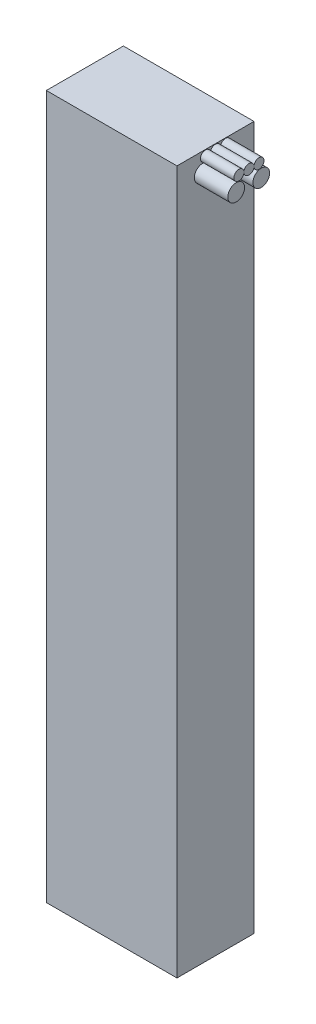
ISO-10303-21;
HEADER;
FILE_DESCRIPTION(('STEP AP214'),'2;1');
FILE_NAME('part.step','',(''),(''),'','','');
FILE_SCHEMA(('AUTOMOTIVE_DESIGN { 1 0 10303 214 1 1 1 1 }'));
ENDSEC;
DATA;
#1=APPLICATION_CONTEXT('core data for automotive mechanical design processes');
#2=APPLICATION_PROTOCOL_DEFINITION('international standard','automotive_design',2000,#1);
#3=PRODUCT_CONTEXT('',#1,'mechanical');
#4=PRODUCT('Part','Part','',(#3));
#5=PRODUCT_RELATED_PRODUCT_CATEGORY('part','',(#4));
#6=PRODUCT_DEFINITION_FORMATION('','',#4);
#7=PRODUCT_DEFINITION_CONTEXT('part definition',#1,'design');
#8=PRODUCT_DEFINITION('design','',#6,#7);
#9=PRODUCT_DEFINITION_SHAPE('','',#8);
#10=(LENGTH_UNIT() NAMED_UNIT(*) SI_UNIT(.MILLI.,.METRE.));
#11=(NAMED_UNIT(*) PLANE_ANGLE_UNIT() SI_UNIT($,.RADIAN.));
#12=(NAMED_UNIT(*) SI_UNIT($,.STERADIAN.) SOLID_ANGLE_UNIT());
#13=UNCERTAINTY_MEASURE_WITH_UNIT(LENGTH_MEASURE(1.E-05),#10,'distance_accuracy_value','');
#14=(GEOMETRIC_REPRESENTATION_CONTEXT(3) GLOBAL_UNCERTAINTY_ASSIGNED_CONTEXT((#13)) GLOBAL_UNIT_ASSIGNED_CONTEXT((#10,
#11,#12)) REPRESENTATION_CONTEXT('',''));
#15=CARTESIAN_POINT('',(0.,0.,0.));
#16=DIRECTION('',(0.,0.,1.));
#17=DIRECTION('',(1.,0.,0.));
#18=AXIS2_PLACEMENT_3D('',#15,#16,#17);
#19=CARTESIAN_POINT('',(14.75,102.158194126435,-1.83612890178128));
#20=DIRECTION('',(-1.,0.,0.));
#21=DIRECTION('',(0.,0.,1.));
#22=AXIS2_PLACEMENT_3D('',#19,#20,#21);
#23=CYLINDRICAL_SURFACE('',#22,1.25);
#24=CARTESIAN_POINT('',(14.75,102.158194126435,-1.83612890178128));
#25=DIRECTION('',(1.,0.,0.));
#26=DIRECTION('',(0.,0.,-1.));
#27=AXIS2_PLACEMENT_3D('',#24,#25,#26);
#28=CIRCLE('',#27,1.25);
#29=CARTESIAN_POINT('',(14.75,102.158194126435,-3.08612890178128));
#30=VERTEX_POINT('',#29);
#31=EDGE_CURVE('E12',#30,#30,#28,.T.);
#32=ORIENTED_EDGE('',*,*,#31,.F.);
#33=EDGE_LOOP('',(#32));
#34=FACE_BOUND('',#33,.T.);
#35=CARTESIAN_POINT('',(9.75,102.158194126435,-1.83612890178128));
#36=DIRECTION('',(1.,0.,0.));
#37=DIRECTION('',(0.,0.,-1.));
#38=AXIS2_PLACEMENT_3D('',#35,#36,#37);
#39=CIRCLE('',#38,1.25);
#40=CARTESIAN_POINT('',(9.75,102.158194126435,-3.08612890178128));
#41=VERTEX_POINT('',#40);
#42=EDGE_CURVE('E56',#41,#41,#39,.T.);
#43=ORIENTED_EDGE('',*,*,#42,.T.);
#44=EDGE_LOOP('',(#43));
#45=FACE_BOUND('',#44,.T.);
#46=ADVANCED_FACE('F53',(#34,#45),#23,.T.);
#47=CARTESIAN_POINT('',(14.75,0.,0.));
#48=DIRECTION('',(1.,0.,0.));
#49=DIRECTION('',(0.,0.,-1.));
#50=AXIS2_PLACEMENT_3D('',#47,#48,#49);
#51=PLANE('',#50);
#52=ORIENTED_EDGE('',*,*,#31,.T.);
#53=EDGE_LOOP('',(#52));
#54=FACE_BOUND('',#53,.T.);
#55=ADVANCED_FACE('F68',(#54),#51,.T.);
#56=CARTESIAN_POINT('',(9.75,0.,0.));
#57=DIRECTION('',(1.,0.,0.));
#58=DIRECTION('',(0.,0.,-1.));
#59=AXIS2_PLACEMENT_3D('',#56,#57,#58);
#60=PLANE('',#59);
#61=ORIENTED_EDGE('',*,*,#42,.F.);
#62=EDGE_LOOP('',(#61));
#63=FACE_BOUND('',#62,.T.);
#64=ADVANCED_FACE('F66',(#63),#60,.F.);
#65=CLOSED_SHELL('',(#46,#55,#64));
#66=MANIFOLD_SOLID_BREP('B2',#65);
#67=CARTESIAN_POINT('',(14.75,104.18946136821,-1.5));
#68=DIRECTION('',(-1.,0.,0.));
#69=DIRECTION('',(0.,0.,1.));
#70=AXIS2_PLACEMENT_3D('',#67,#68,#69);
#71=CYLINDRICAL_SURFACE('',#70,0.75);
#72=CARTESIAN_POINT('',(14.75,104.18946136821,-1.5));
#73=DIRECTION('',(1.,0.,0.));
#74=DIRECTION('',(0.,0.,-1.));
#75=AXIS2_PLACEMENT_3D('',#72,#73,#74);
#76=CIRCLE('',#75,0.75);
#77=CARTESIAN_POINT('',(14.75,104.18946136821,-2.25));
#78=VERTEX_POINT('',#77);
#79=EDGE_CURVE('E52',#78,#78,#76,.T.);
#80=ORIENTED_EDGE('',*,*,#79,.F.);
#81=EDGE_LOOP('',(#80));
#82=FACE_BOUND('',#81,.T.);
#83=CARTESIAN_POINT('',(9.75,104.18946136821,-1.5));
#84=DIRECTION('',(1.,0.,0.));
#85=DIRECTION('',(0.,0.,-1.));
#86=AXIS2_PLACEMENT_3D('',#83,#84,#85);
#87=CIRCLE('',#86,0.75);
#88=CARTESIAN_POINT('',(9.75,104.18946136821,-2.25));
#89=VERTEX_POINT('',#88);
#90=EDGE_CURVE('E104',#89,#89,#87,.T.);
#91=ORIENTED_EDGE('',*,*,#90,.T.);
#92=EDGE_LOOP('',(#91));
#93=FACE_BOUND('',#92,.T.);
#94=ADVANCED_FACE('F101',(#82,#93),#71,.T.);
#95=CARTESIAN_POINT('',(14.75,0.,0.));
#96=DIRECTION('',(1.,0.,0.));
#97=DIRECTION('',(0.,0.,-1.));
#98=AXIS2_PLACEMENT_3D('',#95,#96,#97);
#99=PLANE('',#98);
#100=ORIENTED_EDGE('',*,*,#79,.T.);
#101=EDGE_LOOP('',(#100));
#102=FACE_BOUND('',#101,.T.);
#103=ADVANCED_FACE('F116',(#102),#99,.T.);
#104=CARTESIAN_POINT('',(9.75,0.,0.));
#105=DIRECTION('',(1.,0.,0.));
#106=DIRECTION('',(0.,0.,-1.));
#107=AXIS2_PLACEMENT_3D('',#104,#105,#106);
#108=PLANE('',#107);
#109=ORIENTED_EDGE('',*,*,#90,.F.);
#110=EDGE_LOOP('',(#109));
#111=FACE_BOUND('',#110,.T.);
#112=ADVANCED_FACE('F114',(#111),#108,.F.);
#113=CLOSED_SHELL('',(#94,#103,#112));
#114=MANIFOLD_SOLID_BREP('B7',#113);
#115=CARTESIAN_POINT('',(14.75,104.18946136821,0.));
#116=DIRECTION('',(-1.,0.,0.));
#117=DIRECTION('',(0.,0.,1.));
#118=AXIS2_PLACEMENT_3D('',#115,#116,#117);
#119=CYLINDRICAL_SURFACE('',#118,0.750000000000001);
#120=CARTESIAN_POINT('',(14.75,104.18946136821,0.));
#121=DIRECTION('',(1.,0.,0.));
#122=DIRECTION('',(0.,0.,-1.));
#123=AXIS2_PLACEMENT_3D('',#120,#121,#122);
#124=CIRCLE('',#123,0.750000000000001);
#125=CARTESIAN_POINT('',(14.75,104.18946136821,-0.750000000000002));
#126=VERTEX_POINT('',#125);
#127=EDGE_CURVE('E100',#126,#126,#124,.T.);
#128=ORIENTED_EDGE('',*,*,#127,.F.);
#129=EDGE_LOOP('',(#128));
#130=FACE_BOUND('',#129,.T.);
#131=CARTESIAN_POINT('',(9.75,104.18946136821,0.));
#132=DIRECTION('',(1.,0.,0.));
#133=DIRECTION('',(0.,0.,-1.));
#134=AXIS2_PLACEMENT_3D('',#131,#132,#133);
#135=CIRCLE('',#134,0.750000000000001);
#136=CARTESIAN_POINT('',(9.75,104.18946136821,-0.750000000000002));
#137=VERTEX_POINT('',#136);
#138=EDGE_CURVE('E152',#137,#137,#135,.T.);
#139=ORIENTED_EDGE('',*,*,#138,.T.);
#140=EDGE_LOOP('',(#139));
#141=FACE_BOUND('',#140,.T.);
#142=ADVANCED_FACE('F149',(#130,#141),#119,.T.);
#143=CARTESIAN_POINT('',(14.75,0.,0.));
#144=DIRECTION('',(1.,0.,0.));
#145=DIRECTION('',(0.,0.,-1.));
#146=AXIS2_PLACEMENT_3D('',#143,#144,#145);
#147=PLANE('',#146);
#148=ORIENTED_EDGE('',*,*,#127,.T.);
#149=EDGE_LOOP('',(#148));
#150=FACE_BOUND('',#149,.T.);
#151=ADVANCED_FACE('F164',(#150),#147,.T.);
#152=CARTESIAN_POINT('',(9.75,0.,0.));
#153=DIRECTION('',(1.,0.,0.));
#154=DIRECTION('',(0.,0.,-1.));
#155=AXIS2_PLACEMENT_3D('',#152,#153,#154);
#156=PLANE('',#155);
#157=ORIENTED_EDGE('',*,*,#138,.F.);
#158=EDGE_LOOP('',(#157));
#159=FACE_BOUND('',#158,.T.);
#160=ADVANCED_FACE('F162',(#159),#156,.F.);
#161=CLOSED_SHELL('',(#142,#151,#160));
#162=MANIFOLD_SOLID_BREP('B47',#161);
#163=CARTESIAN_POINT('',(14.75,102.158194126435,1.90871842827711));
#164=DIRECTION('',(-1.,0.,0.));
#165=DIRECTION('',(0.,0.,1.));
#166=AXIS2_PLACEMENT_3D('',#163,#164,#165);
#167=CYLINDRICAL_SURFACE('',#166,1.25);
#168=CARTESIAN_POINT('',(14.75,102.158194126435,1.90871842827711));
#169=DIRECTION('',(1.,0.,0.));
#170=DIRECTION('',(0.,0.,-1.));
#171=AXIS2_PLACEMENT_3D('',#168,#169,#170);
#172=CIRCLE('',#171,1.25);
#173=CARTESIAN_POINT('',(14.75,102.158194126435,0.65871842827711));
#174=VERTEX_POINT('',#173);
#175=EDGE_CURVE('E148',#174,#174,#172,.T.);
#176=ORIENTED_EDGE('',*,*,#175,.F.);
#177=EDGE_LOOP('',(#176));
#178=FACE_BOUND('',#177,.T.);
#179=CARTESIAN_POINT('',(9.75,102.158194126435,1.90871842827711));
#180=DIRECTION('',(1.,0.,0.));
#181=DIRECTION('',(0.,0.,-1.));
#182=AXIS2_PLACEMENT_3D('',#179,#180,#181);
#183=CIRCLE('',#182,1.25);
#184=CARTESIAN_POINT('',(9.75,102.158194126435,0.65871842827711));
#185=VERTEX_POINT('',#184);
#186=EDGE_CURVE('E206',#185,#185,#183,.T.);
#187=ORIENTED_EDGE('',*,*,#186,.T.);
#188=EDGE_LOOP('',(#187));
#189=FACE_BOUND('',#188,.T.);
#190=ADVANCED_FACE('F203',(#178,#189),#167,.T.);
#191=CARTESIAN_POINT('',(14.75,0.,0.));
#192=DIRECTION('',(1.,0.,0.));
#193=DIRECTION('',(0.,0.,-1.));
#194=AXIS2_PLACEMENT_3D('',#191,#192,#193);
#195=PLANE('',#194);
#196=ORIENTED_EDGE('',*,*,#175,.T.);
#197=EDGE_LOOP('',(#196));
#198=FACE_BOUND('',#197,.T.);
#199=ADVANCED_FACE('F218',(#198),#195,.T.);
#200=CARTESIAN_POINT('',(9.75,0.,0.));
#201=DIRECTION('',(1.,0.,0.));
#202=DIRECTION('',(0.,0.,-1.));
#203=AXIS2_PLACEMENT_3D('',#200,#201,#202);
#204=PLANE('',#203);
#205=ORIENTED_EDGE('',*,*,#186,.F.);
#206=EDGE_LOOP('',(#205));
#207=FACE_BOUND('',#206,.T.);
#208=ADVANCED_FACE('F216',(#207),#204,.F.);
#209=CLOSED_SHELL('',(#190,#199,#208));
#210=MANIFOLD_SOLID_BREP('B95',#209);
#211=CARTESIAN_POINT('',(14.75,104.18946136821,1.5));
#212=DIRECTION('',(-1.,0.,0.));
#213=DIRECTION('',(0.,0.,1.));
#214=AXIS2_PLACEMENT_3D('',#211,#212,#213);
#215=CYLINDRICAL_SURFACE('',#214,0.75);
#216=CARTESIAN_POINT('',(14.75,104.18946136821,1.5));
#217=DIRECTION('',(1.,0.,0.));
#218=DIRECTION('',(0.,0.,-1.));
#219=AXIS2_PLACEMENT_3D('',#216,#217,#218);
#220=CIRCLE('',#219,0.75);
#221=CARTESIAN_POINT('',(14.75,104.18946136821,0.749999999999999));
#222=VERTEX_POINT('',#221);
#223=EDGE_CURVE('E202',#222,#222,#220,.T.);
#224=ORIENTED_EDGE('',*,*,#223,.F.);
#225=EDGE_LOOP('',(#224));
#226=FACE_BOUND('',#225,.T.);
#227=CARTESIAN_POINT('',(9.75,104.18946136821,1.5));
#228=DIRECTION('',(1.,0.,0.));
#229=DIRECTION('',(0.,0.,-1.));
#230=AXIS2_PLACEMENT_3D('',#227,#228,#229);
#231=CIRCLE('',#230,0.75);
#232=CARTESIAN_POINT('',(9.75,104.18946136821,0.749999999999999));
#233=VERTEX_POINT('',#232);
#234=EDGE_CURVE('E255',#233,#233,#231,.T.);
#235=ORIENTED_EDGE('',*,*,#234,.T.);
#236=EDGE_LOOP('',(#235));
#237=FACE_BOUND('',#236,.T.);
#238=ADVANCED_FACE('F252',(#226,#237),#215,.T.);
#239=CARTESIAN_POINT('',(14.75,0.,0.));
#240=DIRECTION('',(1.,0.,0.));
#241=DIRECTION('',(0.,0.,-1.));
#242=AXIS2_PLACEMENT_3D('',#239,#240,#241);
#243=PLANE('',#242);
#244=ORIENTED_EDGE('',*,*,#223,.T.);
#245=EDGE_LOOP('',(#244));
#246=FACE_BOUND('',#245,.T.);
#247=ADVANCED_FACE('F267',(#246),#243,.T.);
#248=CARTESIAN_POINT('',(9.75,0.,0.));
#249=DIRECTION('',(1.,0.,0.));
#250=DIRECTION('',(0.,0.,-1.));
#251=AXIS2_PLACEMENT_3D('',#248,#249,#250);
#252=PLANE('',#251);
#253=ORIENTED_EDGE('',*,*,#234,.F.);
#254=EDGE_LOOP('',(#253));
#255=FACE_BOUND('',#254,.T.);
#256=ADVANCED_FACE('F265',(#255),#252,.F.);
#257=CLOSED_SHELL('',(#238,#247,#256));
#258=MANIFOLD_SOLID_BREP('B143',#257);
#259=CARTESIAN_POINT('',(9.75,105.,5.75));
#260=DIRECTION('',(-1.,0.,0.));
#261=DIRECTION('',(0.,0.,1.));
#262=AXIS2_PLACEMENT_3D('',#259,#260,#261);
#263=PLANE('',#262);
#264=DIRECTION('',(0.,0.,-1.));
#265=VECTOR('',#264,1.);
#266=CARTESIAN_POINT('',(9.75,0.,5.75));
#267=LINE('',#266,#265);
#268=CARTESIAN_POINT('',(9.75,0.,5.75));
#269=VERTEX_POINT('',#268);
#270=CARTESIAN_POINT('',(9.75,0.,-5.75));
#271=VERTEX_POINT('',#270);
#272=EDGE_CURVE('E355',#269,#271,#267,.T.);
#273=ORIENTED_EDGE('',*,*,#272,.T.);
#274=DIRECTION('',(0.,-1.,0.));
#275=VECTOR('',#274,1.);
#276=CARTESIAN_POINT('',(9.75,105.,-5.75));
#277=LINE('',#276,#275);
#278=CARTESIAN_POINT('',(9.75,105.,-5.75));
#279=VERTEX_POINT('',#278);
#280=EDGE_CURVE('E250',#279,#271,#277,.T.);
#281=ORIENTED_EDGE('',*,*,#280,.F.);
#282=DIRECTION('',(0.,0.,-1.));
#283=VECTOR('',#282,1.);
#284=CARTESIAN_POINT('',(9.75,105.,5.75));
#285=LINE('',#284,#283);
#286=CARTESIAN_POINT('',(9.75,105.,5.75));
#287=VERTEX_POINT('',#286);
#288=EDGE_CURVE('E343',#287,#279,#285,.T.);
#289=ORIENTED_EDGE('',*,*,#288,.F.);
#290=DIRECTION('',(0.,-1.,0.));
#291=VECTOR('',#290,1.);
#292=CARTESIAN_POINT('',(9.75,105.,5.75));
#293=LINE('',#292,#291);
#294=EDGE_CURVE('E351',#287,#269,#293,.T.);
#295=ORIENTED_EDGE('',*,*,#294,.T.);
#296=EDGE_LOOP('',(#273,#281,#289,#295));
#297=FACE_BOUND('',#296,.T.);
#298=ADVANCED_FACE('F292',(#297),#263,.F.);
#299=CARTESIAN_POINT('',(-9.75,105.,-5.75));
#300=DIRECTION('',(0.,0.,1.));
#301=DIRECTION('',(1.,0.,0.));
#302=AXIS2_PLACEMENT_3D('',#299,#300,#301);
#303=PLANE('',#302);
#304=DIRECTION('',(-1.,0.,0.));
#305=VECTOR('',#304,1.);
#306=CARTESIAN_POINT('',(-9.75,0.,-5.75));
#307=LINE('',#306,#305);
#308=CARTESIAN_POINT('',(-9.75,0.,-5.75));
#309=VERTEX_POINT('',#308);
#310=EDGE_CURVE('E347',#271,#309,#307,.T.);
#311=ORIENTED_EDGE('',*,*,#310,.T.);
#312=DIRECTION('',(0.,-1.,0.));
#313=VECTOR('',#312,1.);
#314=CARTESIAN_POINT('',(-9.75,105.,-5.75));
#315=LINE('',#314,#313);
#316=CARTESIAN_POINT('',(-9.75,105.,-5.75));
#317=VERTEX_POINT('',#316);
#318=EDGE_CURVE('E300',#317,#309,#315,.T.);
#319=ORIENTED_EDGE('',*,*,#318,.F.);
#320=DIRECTION('',(-1.,0.,0.));
#321=VECTOR('',#320,1.);
#322=CARTESIAN_POINT('',(-9.75,105.,-5.75));
#323=LINE('',#322,#321);
#324=EDGE_CURVE('E338',#279,#317,#323,.T.);
#325=ORIENTED_EDGE('',*,*,#324,.F.);
#326=ORIENTED_EDGE('',*,*,#280,.T.);
#327=EDGE_LOOP('',(#311,#319,#325,#326));
#328=FACE_BOUND('',#327,.T.);
#329=ADVANCED_FACE('F346',(#328),#303,.F.);
#330=CARTESIAN_POINT('',(-9.75,105.,5.75));
#331=DIRECTION('',(1.,0.,0.));
#332=DIRECTION('',(0.,0.,-1.));
#333=AXIS2_PLACEMENT_3D('',#330,#331,#332);
#334=PLANE('',#333);
#335=DIRECTION('',(0.,0.,1.));
#336=VECTOR('',#335,1.);
#337=CARTESIAN_POINT('',(-9.75,0.,5.75));
#338=LINE('',#337,#336);
#339=CARTESIAN_POINT('',(-9.75,0.,5.75));
#340=VERTEX_POINT('',#339);
#341=EDGE_CURVE('E325',#309,#340,#338,.T.);
#342=ORIENTED_EDGE('',*,*,#341,.T.);
#343=DIRECTION('',(0.,-1.,0.));
#344=VECTOR('',#343,1.);
#345=CARTESIAN_POINT('',(-9.75,105.,5.75));
#346=LINE('',#345,#344);
#347=CARTESIAN_POINT('',(-9.75,105.,5.75));
#348=VERTEX_POINT('',#347);
#349=EDGE_CURVE('E348',#348,#340,#346,.T.);
#350=ORIENTED_EDGE('',*,*,#349,.F.);
#351=DIRECTION('',(0.,0.,1.));
#352=VECTOR('',#351,1.);
#353=CARTESIAN_POINT('',(-9.75,105.,5.75));
#354=LINE('',#353,#352);
#355=EDGE_CURVE('E341',#317,#348,#354,.T.);
#356=ORIENTED_EDGE('',*,*,#355,.F.);
#357=ORIENTED_EDGE('',*,*,#318,.T.);
#358=EDGE_LOOP('',(#342,#350,#356,#357));
#359=FACE_BOUND('',#358,.T.);
#360=ADVANCED_FACE('F349',(#359),#334,.F.);
#361=CARTESIAN_POINT('',(-9.75,105.,5.75));
#362=DIRECTION('',(0.,0.,-1.));
#363=DIRECTION('',(-1.,0.,0.));
#364=AXIS2_PLACEMENT_3D('',#361,#362,#363);
#365=PLANE('',#364);
#366=DIRECTION('',(1.,0.,0.));
#367=VECTOR('',#366,1.);
#368=CARTESIAN_POINT('',(-9.75,0.,5.75));
#369=LINE('',#368,#367);
#370=EDGE_CURVE('E331',#340,#269,#369,.T.);
#371=ORIENTED_EDGE('',*,*,#370,.T.);
#372=ORIENTED_EDGE('',*,*,#294,.F.);
#373=DIRECTION('',(1.,0.,0.));
#374=VECTOR('',#373,1.);
#375=CARTESIAN_POINT('',(-9.75,105.,5.75));
#376=LINE('',#375,#374);
#377=EDGE_CURVE('E308',#348,#287,#376,.T.);
#378=ORIENTED_EDGE('',*,*,#377,.F.);
#379=ORIENTED_EDGE('',*,*,#349,.T.);
#380=EDGE_LOOP('',(#371,#372,#378,#379));
#381=FACE_BOUND('',#380,.T.);
#382=ADVANCED_FACE('F362',(#381),#365,.F.);
#383=CARTESIAN_POINT('',(0.,105.,0.));
#384=DIRECTION('',(0.,-1.,0.));
#385=DIRECTION('',(0.,0.,-1.));
#386=AXIS2_PLACEMENT_3D('',#383,#384,#385);
#387=PLANE('',#386);
#388=ORIENTED_EDGE('',*,*,#288,.T.);
#389=ORIENTED_EDGE('',*,*,#324,.T.);
#390=ORIENTED_EDGE('',*,*,#355,.T.);
#391=ORIENTED_EDGE('',*,*,#377,.T.);
#392=EDGE_LOOP('',(#388,#389,#390,#391));
#393=FACE_BOUND('',#392,.T.);
#394=ADVANCED_FACE('F339',(#393),#387,.F.);
#395=CARTESIAN_POINT('',(0.,0.,0.));
#396=DIRECTION('',(0.,-1.,0.));
#397=DIRECTION('',(0.,0.,-1.));
#398=AXIS2_PLACEMENT_3D('',#395,#396,#397);
#399=PLANE('',#398);
#400=ORIENTED_EDGE('',*,*,#272,.F.);
#401=ORIENTED_EDGE('',*,*,#370,.F.);
#402=ORIENTED_EDGE('',*,*,#341,.F.);
#403=ORIENTED_EDGE('',*,*,#310,.F.);
#404=EDGE_LOOP('',(#400,#401,#402,#403));
#405=FACE_BOUND('',#404,.T.);
#406=ADVANCED_FACE('F365',(#405),#399,.T.);
#407=CLOSED_SHELL('',(#298,#329,#360,#382,#394,#406));
#408=MANIFOLD_SOLID_BREP('B197',#407);
#409=ADVANCED_BREP_SHAPE_REPRESENTATION('',(#18,#66,#114,#162,#210,#258,#408),#14);
#410=SHAPE_DEFINITION_REPRESENTATION(#9,#409);
ENDSEC;
END-ISO-10303-21;
